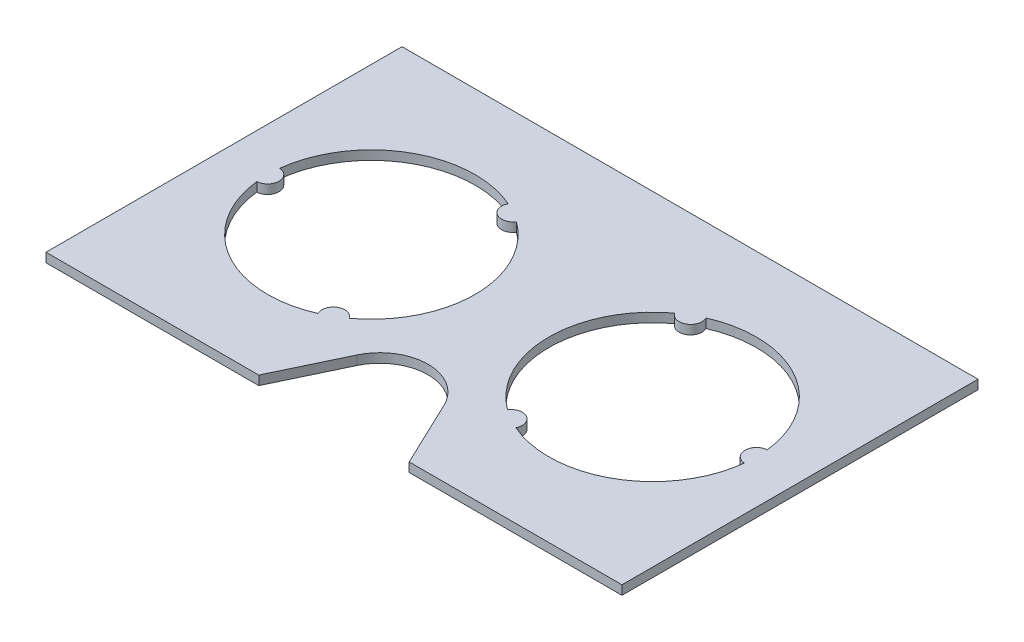
ISO-10303-21;
HEADER;
FILE_DESCRIPTION(('STEP AP214'),'2;1');
FILE_NAME('part.step','',(''),(''),'','','');
FILE_SCHEMA(('AUTOMOTIVE_DESIGN { 1 0 10303 214 1 1 1 1 }'));
ENDSEC;
DATA;
#1=APPLICATION_CONTEXT('core data for automotive mechanical design processes');
#2=APPLICATION_PROTOCOL_DEFINITION('international standard','automotive_design',2000,#1);
#3=PRODUCT_CONTEXT('',#1,'mechanical');
#4=PRODUCT('Part','Part','',(#3));
#5=PRODUCT_RELATED_PRODUCT_CATEGORY('part','',(#4));
#6=PRODUCT_DEFINITION_FORMATION('','',#4);
#7=PRODUCT_DEFINITION_CONTEXT('part definition',#1,'design');
#8=PRODUCT_DEFINITION('design','',#6,#7);
#9=PRODUCT_DEFINITION_SHAPE('','',#8);
#10=(LENGTH_UNIT() NAMED_UNIT(*) SI_UNIT(.MILLI.,.METRE.));
#11=(NAMED_UNIT(*) PLANE_ANGLE_UNIT() SI_UNIT($,.RADIAN.));
#12=(NAMED_UNIT(*) SI_UNIT($,.STERADIAN.) SOLID_ANGLE_UNIT());
#13=UNCERTAINTY_MEASURE_WITH_UNIT(LENGTH_MEASURE(1.E-05),#10,'distance_accuracy_value','');
#14=(GEOMETRIC_REPRESENTATION_CONTEXT(3) GLOBAL_UNCERTAINTY_ASSIGNED_CONTEXT((#13)) GLOBAL_UNIT_ASSIGNED_CONTEXT((#10,
#11,#12)) REPRESENTATION_CONTEXT('',''));
#15=CARTESIAN_POINT('',(0.,0.,0.));
#16=DIRECTION('',(0.,0.,1.));
#17=DIRECTION('',(1.,0.,0.));
#18=AXIS2_PLACEMENT_3D('',#15,#16,#17);
#19=CARTESIAN_POINT('',(62.85,2.,67.7020901521246));
#20=DIRECTION('',(0.,-1.,0.));
#21=DIRECTION('',(0.,0.,-1.));
#22=AXIS2_PLACEMENT_3D('',#19,#20,#21);
#23=PLANE('',#22);
#24=CARTESIAN_POINT('',(9.51,2.,38.85));
#25=DIRECTION('',(0.,-1.,0.));
#26=DIRECTION('',(0.,0.,-1.));
#27=AXIS2_PLACEMENT_3D('',#24,#25,#26);
#28=CIRCLE('',#27,2.5);
#29=CARTESIAN_POINT('',(9.64796909492274,2.,36.3538099974469));
#30=VERTEX_POINT('',#29);
#31=CARTESIAN_POINT('',(9.64796909492274,2.,41.3461900025532));
#32=VERTEX_POINT('',#31);
#33=EDGE_CURVE('E222',#30,#32,#28,.T.);
#34=ORIENTED_EDGE('',*,*,#33,.F.);
#35=CARTESIAN_POINT('',(32.16,2.,38.85));
#36=DIRECTION('',(0.,1.,0.));
#37=DIRECTION('',(0.,0.,-1.));
#38=AXIS2_PLACEMENT_3D('',#35,#36,#37);
#39=CIRCLE('',#38,22.65);
#40=CARTESIAN_POINT('',(41.2542514976548,2.,18.1059143441461));
#41=VERTEX_POINT('',#40);
#42=EDGE_CURVE('E234',#41,#30,#39,.T.);
#43=ORIENTED_EDGE('',*,*,#42,.F.);
#44=CARTESIAN_POINT('',(43.4849999999999,2.,19.2345246042824));
#45=DIRECTION('',(0.,-1.,0.));
#46=DIRECTION('',(0.,0.,1.));
#47=AXIS2_PLACEMENT_3D('',#44,#45,#46);
#48=CIRCLE('',#47,2.5);
#49=CARTESIAN_POINT('',(45.5777794074223,2.,20.6021043466992));
#50=VERTEX_POINT('',#49);
#51=EDGE_CURVE('E231',#50,#41,#48,.T.);
#52=ORIENTED_EDGE('',*,*,#51,.F.);
#53=CARTESIAN_POINT('',(32.16,2.,38.85));
#54=DIRECTION('',(0.,1.,0.));
#55=DIRECTION('',(0.,0.,-1.));
#56=AXIS2_PLACEMENT_3D('',#53,#54,#55);
#57=CIRCLE('',#56,22.65);
#58=CARTESIAN_POINT('',(45.5777794074223,2.,57.0978956533008));
#59=VERTEX_POINT('',#58);
#60=EDGE_CURVE('E229',#59,#50,#57,.T.);
#61=ORIENTED_EDGE('',*,*,#60,.F.);
#62=CARTESIAN_POINT('',(43.4849999999999,2.,58.4654753957176));
#63=DIRECTION('',(0.,-1.,0.));
#64=DIRECTION('',(0.,0.,1.));
#65=AXIS2_PLACEMENT_3D('',#62,#63,#64);
#66=CIRCLE('',#65,2.5);
#67=CARTESIAN_POINT('',(41.2542514976548,2.,59.5940856558539));
#68=VERTEX_POINT('',#67);
#69=EDGE_CURVE('E227',#68,#59,#66,.T.);
#70=ORIENTED_EDGE('',*,*,#69,.F.);
#71=CARTESIAN_POINT('',(32.16,2.,38.85));
#72=DIRECTION('',(0.,1.,0.));
#73=DIRECTION('',(0.,0.,-1.));
#74=AXIS2_PLACEMENT_3D('',#71,#72,#73);
#75=CIRCLE('',#74,22.65);
#76=EDGE_CURVE('E224',#32,#68,#75,.T.);
#77=ORIENTED_EDGE('',*,*,#76,.F.);
#78=EDGE_LOOP('',(#34,#43,#52,#61,#70,#77));
#79=FACE_BOUND('',#78,.T.);
#80=DIRECTION('',(0.,0.,1.));
#81=VECTOR('',#80,1.);
#82=CARTESIAN_POINT('',(0.,2.,0.));
#83=LINE('',#82,#81);
#84=CARTESIAN_POINT('',(0.,2.,0.));
#85=VERTEX_POINT('',#84);
#86=CARTESIAN_POINT('',(0.,2.,77.7));
#87=VERTEX_POINT('',#86);
#88=EDGE_CURVE('E267',#85,#87,#83,.T.);
#89=ORIENTED_EDGE('',*,*,#88,.T.);
#90=DIRECTION('',(1.,0.,0.));
#91=VECTOR('',#90,1.);
#92=CARTESIAN_POINT('',(0.,2.,77.7));
#93=LINE('',#92,#91);
#94=CARTESIAN_POINT('',(46.435,2.,77.7));
#95=VERTEX_POINT('',#94);
#96=EDGE_CURVE('E270',#87,#95,#93,.T.);
#97=ORIENTED_EDGE('',*,*,#96,.T.);
#98=DIRECTION('',(0.429929543633551,0.,-0.902862441078954));
#99=VECTOR('',#98,1.);
#100=CARTESIAN_POINT('',(46.435,2.,77.7));
#101=LINE('',#100,#99);
#102=CARTESIAN_POINT('',(53.35,2.,63.1783327349506));
#103=VERTEX_POINT('',#102);
#104=EDGE_CURVE('E273',#95,#103,#101,.T.);
#105=ORIENTED_EDGE('',*,*,#104,.T.);
#106=CARTESIAN_POINT('',(62.85,2.,67.7020901521246));
#107=DIRECTION('',(0.,-1.,0.));
#108=DIRECTION('',(0.,0.,-1.));
#109=AXIS2_PLACEMENT_3D('',#106,#107,#108);
#110=CIRCLE('',#109,10.5220901521246);
#111=CARTESIAN_POINT('',(72.35,2.,63.1783327349506));
#112=VERTEX_POINT('',#111);
#113=EDGE_CURVE('E275',#103,#112,#110,.T.);
#114=ORIENTED_EDGE('',*,*,#113,.T.);
#115=DIRECTION('',(0.42992954363355,0.,0.902862441078954));
#116=VECTOR('',#115,1.);
#117=CARTESIAN_POINT('',(72.35,2.,63.1783327349506));
#118=LINE('',#117,#116);
#119=CARTESIAN_POINT('',(79.265,2.,77.7));
#120=VERTEX_POINT('',#119);
#121=EDGE_CURVE('E277',#112,#120,#118,.T.);
#122=ORIENTED_EDGE('',*,*,#121,.T.);
#123=DIRECTION('',(1.,0.,0.));
#124=VECTOR('',#123,1.);
#125=CARTESIAN_POINT('',(79.265,2.,77.7));
#126=LINE('',#125,#124);
#127=CARTESIAN_POINT('',(125.7,2.,77.7));
#128=VERTEX_POINT('',#127);
#129=EDGE_CURVE('E279',#120,#128,#126,.T.);
#130=ORIENTED_EDGE('',*,*,#129,.T.);
#131=DIRECTION('',(0.,0.,-1.));
#132=VECTOR('',#131,1.);
#133=CARTESIAN_POINT('',(125.7,2.,0.));
#134=LINE('',#133,#132);
#135=CARTESIAN_POINT('',(125.7,2.,0.));
#136=VERTEX_POINT('',#135);
#137=EDGE_CURVE('E281',#128,#136,#134,.T.);
#138=ORIENTED_EDGE('',*,*,#137,.T.);
#139=DIRECTION('',(-1.,0.,0.));
#140=VECTOR('',#139,1.);
#141=CARTESIAN_POINT('',(0.,2.,0.));
#142=LINE('',#141,#140);
#143=EDGE_CURVE('E283',#136,#85,#142,.T.);
#144=ORIENTED_EDGE('',*,*,#143,.T.);
#145=EDGE_LOOP('',(#89,#97,#105,#114,#122,#130,#138,#144));
#146=FACE_BOUND('',#145,.T.);
#147=CARTESIAN_POINT('',(93.54,2.,38.85));
#148=DIRECTION('',(0.,1.,0.));
#149=DIRECTION('',(0.,0.,1.));
#150=AXIS2_PLACEMENT_3D('',#147,#148,#149);
#151=CIRCLE('',#150,22.65);
#152=CARTESIAN_POINT('',(80.1222205925777,2.,20.6021043466992));
#153=VERTEX_POINT('',#152);
#154=CARTESIAN_POINT('',(80.1222205925777,2.,57.0978956533008));
#155=VERTEX_POINT('',#154);
#156=EDGE_CURVE('E171',#153,#155,#151,.T.);
#157=ORIENTED_EDGE('',*,*,#156,.F.);
#158=CARTESIAN_POINT('',(82.2150000000001,2.,19.2345246042824));
#159=DIRECTION('',(0.,-1.,0.));
#160=DIRECTION('',(0.,0.,-1.));
#161=AXIS2_PLACEMENT_3D('',#158,#159,#160);
#162=CIRCLE('',#161,2.50000000000001);
#163=CARTESIAN_POINT('',(84.4457485023452,2.,18.1059143441461));
#164=VERTEX_POINT('',#163);
#165=EDGE_CURVE('E200',#164,#153,#162,.T.);
#166=ORIENTED_EDGE('',*,*,#165,.F.);
#167=CARTESIAN_POINT('',(93.54,2.,38.85));
#168=DIRECTION('',(0.,1.,0.));
#169=DIRECTION('',(0.,0.,1.));
#170=AXIS2_PLACEMENT_3D('',#167,#168,#169);
#171=CIRCLE('',#170,22.65);
#172=CARTESIAN_POINT('',(116.052030905077,2.,36.3538099974469));
#173=VERTEX_POINT('',#172);
#174=EDGE_CURVE('E198',#173,#164,#171,.T.);
#175=ORIENTED_EDGE('',*,*,#174,.F.);
#176=CARTESIAN_POINT('',(116.19,2.,38.85));
#177=DIRECTION('',(0.,-1.,0.));
#178=DIRECTION('',(0.,0.,1.));
#179=AXIS2_PLACEMENT_3D('',#176,#177,#178);
#180=CIRCLE('',#179,2.5);
#181=CARTESIAN_POINT('',(116.052030905077,2.,41.3461900025531));
#182=VERTEX_POINT('',#181);
#183=EDGE_CURVE('E194',#182,#173,#180,.T.);
#184=ORIENTED_EDGE('',*,*,#183,.F.);
#185=CARTESIAN_POINT('',(93.54,2.,38.85));
#186=DIRECTION('',(0.,1.,0.));
#187=DIRECTION('',(0.,0.,1.));
#188=AXIS2_PLACEMENT_3D('',#185,#186,#187);
#189=CIRCLE('',#188,22.65);
#190=CARTESIAN_POINT('',(84.4457485023452,2.,59.5940856558539));
#191=VERTEX_POINT('',#190);
#192=EDGE_CURVE('E192',#191,#182,#189,.T.);
#193=ORIENTED_EDGE('',*,*,#192,.F.);
#194=CARTESIAN_POINT('',(82.2150000000001,2.,58.4654753957176));
#195=DIRECTION('',(0.,-1.,0.));
#196=DIRECTION('',(0.,0.,-1.));
#197=AXIS2_PLACEMENT_3D('',#194,#195,#196);
#198=CIRCLE('',#197,2.5);
#199=EDGE_CURVE('E179',#155,#191,#198,.T.);
#200=ORIENTED_EDGE('',*,*,#199,.F.);
#201=EDGE_LOOP('',(#157,#166,#175,#184,#193,#200));
#202=FACE_BOUND('',#201,.T.);
#203=ADVANCED_FACE('F34',(#79,#146,#202),#23,.F.);
#204=CARTESIAN_POINT('',(62.85,0.,67.7020901521246));
#205=DIRECTION('',(0.,-1.,0.));
#206=DIRECTION('',(0.,0.,-1.));
#207=AXIS2_PLACEMENT_3D('',#204,#205,#206);
#208=PLANE('',#207);
#209=CARTESIAN_POINT('',(32.16,0.,38.85));
#210=DIRECTION('',(0.,1.,0.));
#211=DIRECTION('',(0.,0.,-1.));
#212=AXIS2_PLACEMENT_3D('',#209,#210,#211);
#213=CIRCLE('',#212,22.65);
#214=CARTESIAN_POINT('',(41.2542514976548,0.,18.1059143441461));
#215=VERTEX_POINT('',#214);
#216=CARTESIAN_POINT('',(9.64796909492274,0.,36.3538099974469));
#217=VERTEX_POINT('',#216);
#218=EDGE_CURVE('E225',#215,#217,#213,.T.);
#219=ORIENTED_EDGE('',*,*,#218,.T.);
#220=CARTESIAN_POINT('',(9.51,0.,38.85));
#221=DIRECTION('',(0.,-1.,0.));
#222=DIRECTION('',(0.,0.,-1.));
#223=AXIS2_PLACEMENT_3D('',#220,#221,#222);
#224=CIRCLE('',#223,2.5);
#225=CARTESIAN_POINT('',(9.64796909492274,0.,41.3461900025532));
#226=VERTEX_POINT('',#225);
#227=EDGE_CURVE('E187',#217,#226,#224,.T.);
#228=ORIENTED_EDGE('',*,*,#227,.T.);
#229=CARTESIAN_POINT('',(32.16,0.,38.85));
#230=DIRECTION('',(0.,1.,0.));
#231=DIRECTION('',(0.,0.,-1.));
#232=AXIS2_PLACEMENT_3D('',#229,#230,#231);
#233=CIRCLE('',#232,22.65);
#234=CARTESIAN_POINT('',(41.2542514976548,0.,59.5940856558539));
#235=VERTEX_POINT('',#234);
#236=EDGE_CURVE('E239',#226,#235,#233,.T.);
#237=ORIENTED_EDGE('',*,*,#236,.T.);
#238=CARTESIAN_POINT('',(43.4849999999999,0.,58.4654753957176));
#239=DIRECTION('',(0.,-1.,0.));
#240=DIRECTION('',(0.,0.,1.));
#241=AXIS2_PLACEMENT_3D('',#238,#239,#240);
#242=CIRCLE('',#241,2.5);
#243=CARTESIAN_POINT('',(45.5777794074223,0.,57.0978956533008));
#244=VERTEX_POINT('',#243);
#245=EDGE_CURVE('E242',#235,#244,#242,.T.);
#246=ORIENTED_EDGE('',*,*,#245,.T.);
#247=CARTESIAN_POINT('',(32.16,0.,38.85));
#248=DIRECTION('',(0.,1.,0.));
#249=DIRECTION('',(0.,0.,-1.));
#250=AXIS2_PLACEMENT_3D('',#247,#248,#249);
#251=CIRCLE('',#250,22.65);
#252=CARTESIAN_POINT('',(45.5777794074223,0.,20.6021043466992));
#253=VERTEX_POINT('',#252);
#254=EDGE_CURVE('E245',#244,#253,#251,.T.);
#255=ORIENTED_EDGE('',*,*,#254,.T.);
#256=CARTESIAN_POINT('',(43.4849999999999,0.,19.2345246042824));
#257=DIRECTION('',(0.,-1.,0.));
#258=DIRECTION('',(0.,0.,1.));
#259=AXIS2_PLACEMENT_3D('',#256,#257,#258);
#260=CIRCLE('',#259,2.5);
#261=EDGE_CURVE('E248',#253,#215,#260,.T.);
#262=ORIENTED_EDGE('',*,*,#261,.T.);
#263=EDGE_LOOP('',(#219,#228,#237,#246,#255,#262));
#264=FACE_BOUND('',#263,.T.);
#265=DIRECTION('',(0.,0.,1.));
#266=VECTOR('',#265,1.);
#267=CARTESIAN_POINT('',(0.,0.,0.));
#268=LINE('',#267,#266);
#269=CARTESIAN_POINT('',(0.,0.,0.));
#270=VERTEX_POINT('',#269);
#271=CARTESIAN_POINT('',(0.,0.,77.7));
#272=VERTEX_POINT('',#271);
#273=EDGE_CURVE('E266',#270,#272,#268,.T.);
#274=ORIENTED_EDGE('',*,*,#273,.F.);
#275=DIRECTION('',(-1.,0.,0.));
#276=VECTOR('',#275,1.);
#277=CARTESIAN_POINT('',(0.,0.,0.));
#278=LINE('',#277,#276);
#279=CARTESIAN_POINT('',(125.7,0.,0.));
#280=VERTEX_POINT('',#279);
#281=EDGE_CURVE('E271',#280,#270,#278,.T.);
#282=ORIENTED_EDGE('',*,*,#281,.F.);
#283=DIRECTION('',(0.,0.,-1.));
#284=VECTOR('',#283,1.);
#285=CARTESIAN_POINT('',(125.7,0.,0.));
#286=LINE('',#285,#284);
#287=CARTESIAN_POINT('',(125.7,0.,77.7));
#288=VERTEX_POINT('',#287);
#289=EDGE_CURVE('E298',#288,#280,#286,.T.);
#290=ORIENTED_EDGE('',*,*,#289,.F.);
#291=DIRECTION('',(1.,0.,0.));
#292=VECTOR('',#291,1.);
#293=CARTESIAN_POINT('',(79.265,0.,77.7));
#294=LINE('',#293,#292);
#295=CARTESIAN_POINT('',(79.265,0.,77.7));
#296=VERTEX_POINT('',#295);
#297=EDGE_CURVE('E296',#296,#288,#294,.T.);
#298=ORIENTED_EDGE('',*,*,#297,.F.);
#299=DIRECTION('',(0.42992954363355,0.,0.902862441078954));
#300=VECTOR('',#299,1.);
#301=CARTESIAN_POINT('',(72.35,0.,63.1783327349506));
#302=LINE('',#301,#300);
#303=CARTESIAN_POINT('',(72.35,0.,63.1783327349506));
#304=VERTEX_POINT('',#303);
#305=EDGE_CURVE('E294',#304,#296,#302,.T.);
#306=ORIENTED_EDGE('',*,*,#305,.F.);
#307=CARTESIAN_POINT('',(62.85,0.,67.7020901521246));
#308=DIRECTION('',(0.,-1.,0.));
#309=DIRECTION('',(0.,0.,-1.));
#310=AXIS2_PLACEMENT_3D('',#307,#308,#309);
#311=CIRCLE('',#310,10.5220901521246);
#312=CARTESIAN_POINT('',(53.35,0.,63.1783327349506));
#313=VERTEX_POINT('',#312);
#314=EDGE_CURVE('E292',#313,#304,#311,.T.);
#315=ORIENTED_EDGE('',*,*,#314,.F.);
#316=DIRECTION('',(0.429929543633551,0.,-0.902862441078954));
#317=VECTOR('',#316,1.);
#318=CARTESIAN_POINT('',(46.435,0.,77.7));
#319=LINE('',#318,#317);
#320=CARTESIAN_POINT('',(46.435,0.,77.7));
#321=VERTEX_POINT('',#320);
#322=EDGE_CURVE('E290',#321,#313,#319,.T.);
#323=ORIENTED_EDGE('',*,*,#322,.F.);
#324=DIRECTION('',(1.,0.,0.));
#325=VECTOR('',#324,1.);
#326=CARTESIAN_POINT('',(0.,0.,77.7));
#327=LINE('',#326,#325);
#328=EDGE_CURVE('E288',#272,#321,#327,.T.);
#329=ORIENTED_EDGE('',*,*,#328,.F.);
#330=EDGE_LOOP('',(#274,#282,#290,#298,#306,#315,#323,#329));
#331=FACE_BOUND('',#330,.T.);
#332=CARTESIAN_POINT('',(82.2150000000001,0.,19.2345246042824));
#333=DIRECTION('',(0.,-1.,0.));
#334=DIRECTION('',(0.,0.,-1.));
#335=AXIS2_PLACEMENT_3D('',#332,#333,#334);
#336=CIRCLE('',#335,2.50000000000001);
#337=CARTESIAN_POINT('',(84.4457485023452,0.,18.1059143441461));
#338=VERTEX_POINT('',#337);
#339=CARTESIAN_POINT('',(80.1222205925777,0.,20.6021043466992));
#340=VERTEX_POINT('',#339);
#341=EDGE_CURVE('E180',#338,#340,#336,.T.);
#342=ORIENTED_EDGE('',*,*,#341,.T.);
#343=CARTESIAN_POINT('',(93.54,0.,38.85));
#344=DIRECTION('',(0.,1.,0.));
#345=DIRECTION('',(0.,0.,1.));
#346=AXIS2_PLACEMENT_3D('',#343,#344,#345);
#347=CIRCLE('',#346,22.65);
#348=CARTESIAN_POINT('',(80.1222205925777,0.,57.0978956533008));
#349=VERTEX_POINT('',#348);
#350=EDGE_CURVE('E57',#340,#349,#347,.T.);
#351=ORIENTED_EDGE('',*,*,#350,.T.);
#352=CARTESIAN_POINT('',(82.2150000000001,0.,58.4654753957176));
#353=DIRECTION('',(0.,-1.,0.));
#354=DIRECTION('',(0.,0.,-1.));
#355=AXIS2_PLACEMENT_3D('',#352,#353,#354);
#356=CIRCLE('',#355,2.5);
#357=CARTESIAN_POINT('',(84.4457485023452,0.,59.5940856558539));
#358=VERTEX_POINT('',#357);
#359=EDGE_CURVE('E186',#349,#358,#356,.T.);
#360=ORIENTED_EDGE('',*,*,#359,.T.);
#361=CARTESIAN_POINT('',(93.54,0.,38.85));
#362=DIRECTION('',(0.,1.,0.));
#363=DIRECTION('',(0.,0.,1.));
#364=AXIS2_PLACEMENT_3D('',#361,#362,#363);
#365=CIRCLE('',#364,22.65);
#366=CARTESIAN_POINT('',(116.052030905077,0.,41.3461900025531));
#367=VERTEX_POINT('',#366);
#368=EDGE_CURVE('E204',#358,#367,#365,.T.);
#369=ORIENTED_EDGE('',*,*,#368,.T.);
#370=CARTESIAN_POINT('',(116.19,0.,38.85));
#371=DIRECTION('',(0.,-1.,0.));
#372=DIRECTION('',(0.,0.,1.));
#373=AXIS2_PLACEMENT_3D('',#370,#371,#372);
#374=CIRCLE('',#373,2.5);
#375=CARTESIAN_POINT('',(116.052030905077,0.,36.3538099974469));
#376=VERTEX_POINT('',#375);
#377=EDGE_CURVE('E207',#367,#376,#374,.T.);
#378=ORIENTED_EDGE('',*,*,#377,.T.);
#379=CARTESIAN_POINT('',(93.54,0.,38.85));
#380=DIRECTION('',(0.,1.,0.));
#381=DIRECTION('',(0.,0.,1.));
#382=AXIS2_PLACEMENT_3D('',#379,#380,#381);
#383=CIRCLE('',#382,22.65);
#384=EDGE_CURVE('E210',#376,#338,#383,.T.);
#385=ORIENTED_EDGE('',*,*,#384,.T.);
#386=EDGE_LOOP('',(#342,#351,#360,#369,#378,#385));
#387=FACE_BOUND('',#386,.T.);
#388=ADVANCED_FACE('F328',(#264,#331,#387),#208,.T.);
#389=CARTESIAN_POINT('',(0.,2.,0.));
#390=DIRECTION('',(1.,0.,0.));
#391=DIRECTION('',(0.,0.,-1.));
#392=AXIS2_PLACEMENT_3D('',#389,#390,#391);
#393=PLANE('',#392);
#394=ORIENTED_EDGE('',*,*,#273,.T.);
#395=DIRECTION('',(0.,-1.,0.));
#396=VECTOR('',#395,1.);
#397=CARTESIAN_POINT('',(0.,2.,77.7));
#398=LINE('',#397,#396);
#399=EDGE_CURVE('E11',#87,#272,#398,.T.);
#400=ORIENTED_EDGE('',*,*,#399,.F.);
#401=ORIENTED_EDGE('',*,*,#88,.F.);
#402=DIRECTION('',(0.,-1.,0.));
#403=VECTOR('',#402,1.);
#404=CARTESIAN_POINT('',(0.,2.,0.));
#405=LINE('',#404,#403);
#406=EDGE_CURVE('E285',#85,#270,#405,.T.);
#407=ORIENTED_EDGE('',*,*,#406,.T.);
#408=EDGE_LOOP('',(#394,#400,#401,#407));
#409=FACE_BOUND('',#408,.T.);
#410=ADVANCED_FACE('F36',(#409),#393,.F.);
#411=CARTESIAN_POINT('',(0.,2.,77.7));
#412=DIRECTION('',(0.,0.,-1.));
#413=DIRECTION('',(-1.,0.,0.));
#414=AXIS2_PLACEMENT_3D('',#411,#412,#413);
#415=PLANE('',#414);
#416=ORIENTED_EDGE('',*,*,#328,.T.);
#417=DIRECTION('',(0.,-1.,0.));
#418=VECTOR('',#417,1.);
#419=CARTESIAN_POINT('',(46.435,2.,77.7));
#420=LINE('',#419,#418);
#421=EDGE_CURVE('E42',#95,#321,#420,.T.);
#422=ORIENTED_EDGE('',*,*,#421,.F.);
#423=ORIENTED_EDGE('',*,*,#96,.F.);
#424=ORIENTED_EDGE('',*,*,#399,.T.);
#425=EDGE_LOOP('',(#416,#422,#423,#424));
#426=FACE_BOUND('',#425,.T.);
#427=ADVANCED_FACE('F345',(#426),#415,.F.);
#428=CARTESIAN_POINT('',(46.435,2.,77.7));
#429=DIRECTION('',(-0.902862441078954,0.,-0.429929543633551));
#430=DIRECTION('',(-0.429929543633551,0.,0.902862441078954));
#431=AXIS2_PLACEMENT_3D('',#428,#429,#430);
#432=PLANE('',#431);
#433=ORIENTED_EDGE('',*,*,#322,.T.);
#434=DIRECTION('',(0.,-1.,0.));
#435=VECTOR('',#434,1.);
#436=CARTESIAN_POINT('',(53.35,2.,63.1783327349506));
#437=LINE('',#436,#435);
#438=EDGE_CURVE('E315',#103,#313,#437,.T.);
#439=ORIENTED_EDGE('',*,*,#438,.F.);
#440=ORIENTED_EDGE('',*,*,#104,.F.);
#441=ORIENTED_EDGE('',*,*,#421,.T.);
#442=EDGE_LOOP('',(#433,#439,#440,#441));
#443=FACE_BOUND('',#442,.T.);
#444=ADVANCED_FACE('F322',(#443),#432,.F.);
#445=CARTESIAN_POINT('',(62.85,2.,67.7020901521246));
#446=DIRECTION('',(0.,-1.,0.));
#447=DIRECTION('',(0.,0.,-1.));
#448=AXIS2_PLACEMENT_3D('',#445,#446,#447);
#449=CYLINDRICAL_SURFACE('',#448,10.5220901521246);
#450=ORIENTED_EDGE('',*,*,#314,.T.);
#451=DIRECTION('',(0.,-1.,0.));
#452=VECTOR('',#451,1.);
#453=CARTESIAN_POINT('',(72.35,2.,63.1783327349506));
#454=LINE('',#453,#452);
#455=EDGE_CURVE('E312',#112,#304,#454,.T.);
#456=ORIENTED_EDGE('',*,*,#455,.F.);
#457=ORIENTED_EDGE('',*,*,#113,.F.);
#458=ORIENTED_EDGE('',*,*,#438,.T.);
#459=EDGE_LOOP('',(#450,#456,#457,#458));
#460=FACE_BOUND('',#459,.T.);
#461=ADVANCED_FACE('F334',(#460),#449,.F.);
#462=CARTESIAN_POINT('',(72.35,2.,63.1783327349506));
#463=DIRECTION('',(0.902862441078954,0.,-0.42992954363355));
#464=DIRECTION('',(-0.42992954363355,0.,-0.902862441078954));
#465=AXIS2_PLACEMENT_3D('',#462,#463,#464);
#466=PLANE('',#465);
#467=ORIENTED_EDGE('',*,*,#305,.T.);
#468=DIRECTION('',(0.,-1.,0.));
#469=VECTOR('',#468,1.);
#470=CARTESIAN_POINT('',(79.265,2.,77.7));
#471=LINE('',#470,#469);
#472=EDGE_CURVE('E309',#120,#296,#471,.T.);
#473=ORIENTED_EDGE('',*,*,#472,.F.);
#474=ORIENTED_EDGE('',*,*,#121,.F.);
#475=ORIENTED_EDGE('',*,*,#455,.T.);
#476=EDGE_LOOP('',(#467,#473,#474,#475));
#477=FACE_BOUND('',#476,.T.);
#478=ADVANCED_FACE('F338',(#477),#466,.F.);
#479=CARTESIAN_POINT('',(79.265,2.,77.7));
#480=DIRECTION('',(0.,0.,-1.));
#481=DIRECTION('',(-1.,0.,0.));
#482=AXIS2_PLACEMENT_3D('',#479,#480,#481);
#483=PLANE('',#482);
#484=ORIENTED_EDGE('',*,*,#297,.T.);
#485=DIRECTION('',(0.,-1.,0.));
#486=VECTOR('',#485,1.);
#487=CARTESIAN_POINT('',(125.7,2.,77.7));
#488=LINE('',#487,#486);
#489=EDGE_CURVE('E306',#128,#288,#488,.T.);
#490=ORIENTED_EDGE('',*,*,#489,.F.);
#491=ORIENTED_EDGE('',*,*,#129,.F.);
#492=ORIENTED_EDGE('',*,*,#472,.T.);
#493=EDGE_LOOP('',(#484,#490,#491,#492));
#494=FACE_BOUND('',#493,.T.);
#495=ADVANCED_FACE('F358',(#494),#483,.F.);
#496=CARTESIAN_POINT('',(125.7,2.,0.));
#497=DIRECTION('',(-1.,0.,0.));
#498=DIRECTION('',(0.,0.,1.));
#499=AXIS2_PLACEMENT_3D('',#496,#497,#498);
#500=PLANE('',#499);
#501=ORIENTED_EDGE('',*,*,#289,.T.);
#502=DIRECTION('',(0.,-1.,0.));
#503=VECTOR('',#502,1.);
#504=CARTESIAN_POINT('',(125.7,2.,0.));
#505=LINE('',#504,#503);
#506=EDGE_CURVE('E303',#136,#280,#505,.T.);
#507=ORIENTED_EDGE('',*,*,#506,.F.);
#508=ORIENTED_EDGE('',*,*,#137,.F.);
#509=ORIENTED_EDGE('',*,*,#489,.T.);
#510=EDGE_LOOP('',(#501,#507,#508,#509));
#511=FACE_BOUND('',#510,.T.);
#512=ADVANCED_FACE('F356',(#511),#500,.F.);
#513=CARTESIAN_POINT('',(0.,2.,0.));
#514=DIRECTION('',(0.,0.,1.));
#515=DIRECTION('',(1.,0.,0.));
#516=AXIS2_PLACEMENT_3D('',#513,#514,#515);
#517=PLANE('',#516);
#518=ORIENTED_EDGE('',*,*,#281,.T.);
#519=ORIENTED_EDGE('',*,*,#406,.F.);
#520=ORIENTED_EDGE('',*,*,#143,.F.);
#521=ORIENTED_EDGE('',*,*,#506,.T.);
#522=EDGE_LOOP('',(#518,#519,#520,#521));
#523=FACE_BOUND('',#522,.T.);
#524=ADVANCED_FACE('F351',(#523),#517,.F.);
#525=CARTESIAN_POINT('',(9.51,2.,38.85));
#526=DIRECTION('',(0.,-1.,0.));
#527=DIRECTION('',(0.,0.,-1.));
#528=AXIS2_PLACEMENT_3D('',#525,#526,#527);
#529=CYLINDRICAL_SURFACE('',#528,2.5);
#530=ORIENTED_EDGE('',*,*,#227,.F.);
#531=DIRECTION('',(0.,-1.,0.));
#532=VECTOR('',#531,1.);
#533=CARTESIAN_POINT('',(9.64796909492274,2.,36.3538099974469));
#534=LINE('',#533,#532);
#535=EDGE_CURVE('E236',#30,#217,#534,.T.);
#536=ORIENTED_EDGE('',*,*,#535,.F.);
#537=ORIENTED_EDGE('',*,*,#33,.T.);
#538=DIRECTION('',(0.,-1.,0.));
#539=VECTOR('',#538,1.);
#540=CARTESIAN_POINT('',(9.64796909492274,2.,41.3461900025532));
#541=LINE('',#540,#539);
#542=EDGE_CURVE('E263',#32,#226,#541,.T.);
#543=ORIENTED_EDGE('',*,*,#542,.T.);
#544=EDGE_LOOP('',(#530,#536,#537,#543));
#545=FACE_BOUND('',#544,.T.);
#546=ADVANCED_FACE('F377',(#545),#529,.T.);
#547=CARTESIAN_POINT('',(32.16,2.,38.85));
#548=DIRECTION('',(0.,-1.,0.));
#549=DIRECTION('',(0.,0.,-1.));
#550=AXIS2_PLACEMENT_3D('',#547,#548,#549);
#551=CYLINDRICAL_SURFACE('',#550,22.65);
#552=ORIENTED_EDGE('',*,*,#236,.F.);
#553=ORIENTED_EDGE('',*,*,#542,.F.);
#554=ORIENTED_EDGE('',*,*,#76,.T.);
#555=DIRECTION('',(0.,-1.,0.));
#556=VECTOR('',#555,1.);
#557=CARTESIAN_POINT('',(41.2542514976548,2.,59.5940856558539));
#558=LINE('',#557,#556);
#559=EDGE_CURVE('E261',#68,#235,#558,.T.);
#560=ORIENTED_EDGE('',*,*,#559,.T.);
#561=EDGE_LOOP('',(#552,#553,#554,#560));
#562=FACE_BOUND('',#561,.T.);
#563=ADVANCED_FACE('F384',(#562),#551,.F.);
#564=CARTESIAN_POINT('',(43.4849999999999,2.,58.4654753957176));
#565=DIRECTION('',(0.,-1.,0.));
#566=DIRECTION('',(0.,0.,-1.));
#567=AXIS2_PLACEMENT_3D('',#564,#565,#566);
#568=CYLINDRICAL_SURFACE('',#567,2.5);
#569=ORIENTED_EDGE('',*,*,#245,.F.);
#570=ORIENTED_EDGE('',*,*,#559,.F.);
#571=ORIENTED_EDGE('',*,*,#69,.T.);
#572=DIRECTION('',(0.,-1.,0.));
#573=VECTOR('',#572,1.);
#574=CARTESIAN_POINT('',(45.5777794074223,2.,57.0978956533008));
#575=LINE('',#574,#573);
#576=EDGE_CURVE('E259',#59,#244,#575,.T.);
#577=ORIENTED_EDGE('',*,*,#576,.T.);
#578=EDGE_LOOP('',(#569,#570,#571,#577));
#579=FACE_BOUND('',#578,.T.);
#580=ADVANCED_FACE('F389',(#579),#568,.T.);
#581=CARTESIAN_POINT('',(32.16,2.,38.85));
#582=DIRECTION('',(0.,-1.,0.));
#583=DIRECTION('',(0.,0.,-1.));
#584=AXIS2_PLACEMENT_3D('',#581,#582,#583);
#585=CYLINDRICAL_SURFACE('',#584,22.65);
#586=ORIENTED_EDGE('',*,*,#254,.F.);
#587=ORIENTED_EDGE('',*,*,#576,.F.);
#588=ORIENTED_EDGE('',*,*,#60,.T.);
#589=DIRECTION('',(0.,-1.,0.));
#590=VECTOR('',#589,1.);
#591=CARTESIAN_POINT('',(45.5777794074223,2.,20.6021043466992));
#592=LINE('',#591,#590);
#593=EDGE_CURVE('E257',#50,#253,#592,.T.);
#594=ORIENTED_EDGE('',*,*,#593,.T.);
#595=EDGE_LOOP('',(#586,#587,#588,#594));
#596=FACE_BOUND('',#595,.T.);
#597=ADVANCED_FACE('F411',(#596),#585,.F.);
#598=CARTESIAN_POINT('',(43.4849999999999,2.,19.2345246042824));
#599=DIRECTION('',(0.,-1.,0.));
#600=DIRECTION('',(0.,0.,-1.));
#601=AXIS2_PLACEMENT_3D('',#598,#599,#600);
#602=CYLINDRICAL_SURFACE('',#601,2.5);
#603=ORIENTED_EDGE('',*,*,#261,.F.);
#604=ORIENTED_EDGE('',*,*,#593,.F.);
#605=ORIENTED_EDGE('',*,*,#51,.T.);
#606=DIRECTION('',(0.,-1.,0.));
#607=VECTOR('',#606,1.);
#608=CARTESIAN_POINT('',(41.2542514976548,2.,18.1059143441461));
#609=LINE('',#608,#607);
#610=EDGE_CURVE('E255',#41,#215,#609,.T.);
#611=ORIENTED_EDGE('',*,*,#610,.T.);
#612=EDGE_LOOP('',(#603,#604,#605,#611));
#613=FACE_BOUND('',#612,.T.);
#614=ADVANCED_FACE('F401',(#613),#602,.T.);
#615=CARTESIAN_POINT('',(32.16,2.,38.85));
#616=DIRECTION('',(0.,-1.,0.));
#617=DIRECTION('',(0.,0.,-1.));
#618=AXIS2_PLACEMENT_3D('',#615,#616,#617);
#619=CYLINDRICAL_SURFACE('',#618,22.65);
#620=ORIENTED_EDGE('',*,*,#218,.F.);
#621=ORIENTED_EDGE('',*,*,#610,.F.);
#622=ORIENTED_EDGE('',*,*,#42,.T.);
#623=ORIENTED_EDGE('',*,*,#535,.T.);
#624=EDGE_LOOP('',(#620,#621,#622,#623));
#625=FACE_BOUND('',#624,.T.);
#626=ADVANCED_FACE('F395',(#625),#619,.F.);
#627=CARTESIAN_POINT('',(93.54,2.,38.85));
#628=DIRECTION('',(0.,-1.,0.));
#629=DIRECTION('',(0.,0.,-1.));
#630=AXIS2_PLACEMENT_3D('',#627,#628,#629);
#631=CYLINDRICAL_SURFACE('',#630,22.65);
#632=ORIENTED_EDGE('',*,*,#350,.F.);
#633=DIRECTION('',(0.,-1.,0.));
#634=VECTOR('',#633,1.);
#635=CARTESIAN_POINT('',(80.1222205925777,2.,20.6021043466992));
#636=LINE('',#635,#634);
#637=EDGE_CURVE('E175',#153,#340,#636,.T.);
#638=ORIENTED_EDGE('',*,*,#637,.F.);
#639=ORIENTED_EDGE('',*,*,#156,.T.);
#640=DIRECTION('',(0.,-1.,0.));
#641=VECTOR('',#640,1.);
#642=CARTESIAN_POINT('',(80.1222205925777,2.,57.0978956533008));
#643=LINE('',#642,#641);
#644=EDGE_CURVE('E174',#155,#349,#643,.T.);
#645=ORIENTED_EDGE('',*,*,#644,.T.);
#646=EDGE_LOOP('',(#632,#638,#639,#645));
#647=FACE_BOUND('',#646,.T.);
#648=ADVANCED_FACE('F173',(#647),#631,.F.);
#649=CARTESIAN_POINT('',(82.2150000000001,2.,58.4654753957176));
#650=DIRECTION('',(0.,-1.,0.));
#651=DIRECTION('',(0.,0.,-1.));
#652=AXIS2_PLACEMENT_3D('',#649,#650,#651);
#653=CYLINDRICAL_SURFACE('',#652,2.5);
#654=ORIENTED_EDGE('',*,*,#359,.F.);
#655=ORIENTED_EDGE('',*,*,#644,.F.);
#656=ORIENTED_EDGE('',*,*,#199,.T.);
#657=DIRECTION('',(0.,-1.,0.));
#658=VECTOR('',#657,1.);
#659=CARTESIAN_POINT('',(84.4457485023452,2.,59.5940856558539));
#660=LINE('',#659,#658);
#661=EDGE_CURVE('E188',#191,#358,#660,.T.);
#662=ORIENTED_EDGE('',*,*,#661,.T.);
#663=EDGE_LOOP('',(#654,#655,#656,#662));
#664=FACE_BOUND('',#663,.T.);
#665=ADVANCED_FACE('F183',(#664),#653,.T.);
#666=CARTESIAN_POINT('',(93.54,2.,38.85));
#667=DIRECTION('',(0.,-1.,0.));
#668=DIRECTION('',(0.,0.,-1.));
#669=AXIS2_PLACEMENT_3D('',#666,#667,#668);
#670=CYLINDRICAL_SURFACE('',#669,22.65);
#671=ORIENTED_EDGE('',*,*,#368,.F.);
#672=ORIENTED_EDGE('',*,*,#661,.F.);
#673=ORIENTED_EDGE('',*,*,#192,.T.);
#674=DIRECTION('',(0.,-1.,0.));
#675=VECTOR('',#674,1.);
#676=CARTESIAN_POINT('',(116.052030905077,2.,41.3461900025531));
#677=LINE('',#676,#675);
#678=EDGE_CURVE('E219',#182,#367,#677,.T.);
#679=ORIENTED_EDGE('',*,*,#678,.T.);
#680=EDGE_LOOP('',(#671,#672,#673,#679));
#681=FACE_BOUND('',#680,.T.);
#682=ADVANCED_FACE('F427',(#681),#670,.F.);
#683=CARTESIAN_POINT('',(116.19,2.,38.85));
#684=DIRECTION('',(0.,-1.,0.));
#685=DIRECTION('',(0.,0.,-1.));
#686=AXIS2_PLACEMENT_3D('',#683,#684,#685);
#687=CYLINDRICAL_SURFACE('',#686,2.5);
#688=ORIENTED_EDGE('',*,*,#377,.F.);
#689=ORIENTED_EDGE('',*,*,#678,.F.);
#690=ORIENTED_EDGE('',*,*,#183,.T.);
#691=DIRECTION('',(0.,-1.,0.));
#692=VECTOR('',#691,1.);
#693=CARTESIAN_POINT('',(116.052030905077,2.,36.3538099974469));
#694=LINE('',#693,#692);
#695=EDGE_CURVE('E217',#173,#376,#694,.T.);
#696=ORIENTED_EDGE('',*,*,#695,.T.);
#697=EDGE_LOOP('',(#688,#689,#690,#696));
#698=FACE_BOUND('',#697,.T.);
#699=ADVANCED_FACE('F430',(#698),#687,.T.);
#700=CARTESIAN_POINT('',(93.54,2.,38.85));
#701=DIRECTION('',(0.,-1.,0.));
#702=DIRECTION('',(0.,0.,-1.));
#703=AXIS2_PLACEMENT_3D('',#700,#701,#702);
#704=CYLINDRICAL_SURFACE('',#703,22.65);
#705=ORIENTED_EDGE('',*,*,#384,.F.);
#706=ORIENTED_EDGE('',*,*,#695,.F.);
#707=ORIENTED_EDGE('',*,*,#174,.T.);
#708=DIRECTION('',(0.,-1.,0.));
#709=VECTOR('',#708,1.);
#710=CARTESIAN_POINT('',(84.4457485023452,2.,18.1059143441461));
#711=LINE('',#710,#709);
#712=EDGE_CURVE('E49',#164,#338,#711,.T.);
#713=ORIENTED_EDGE('',*,*,#712,.T.);
#714=EDGE_LOOP('',(#705,#706,#707,#713));
#715=FACE_BOUND('',#714,.T.);
#716=ADVANCED_FACE('F434',(#715),#704,.F.);
#717=CARTESIAN_POINT('',(82.2150000000001,2.,19.2345246042824));
#718=DIRECTION('',(0.,-1.,0.));
#719=DIRECTION('',(0.,0.,-1.));
#720=AXIS2_PLACEMENT_3D('',#717,#718,#719);
#721=CYLINDRICAL_SURFACE('',#720,2.50000000000001);
#722=ORIENTED_EDGE('',*,*,#341,.F.);
#723=ORIENTED_EDGE('',*,*,#712,.F.);
#724=ORIENTED_EDGE('',*,*,#165,.T.);
#725=ORIENTED_EDGE('',*,*,#637,.T.);
#726=EDGE_LOOP('',(#722,#723,#724,#725));
#727=FACE_BOUND('',#726,.T.);
#728=ADVANCED_FACE('F438',(#727),#721,.T.);
#729=CLOSED_SHELL('',(#203,#388,#410,#427,#444,#461,#478,#495,#512,#524,#546,#563,#580,#597,
#614,#626,#648,#665,#682,#699,#716,#728));
#730=MANIFOLD_SOLID_BREP('B2',#729);
#731=ADVANCED_BREP_SHAPE_REPRESENTATION('',(#18,#730),#14);
#732=SHAPE_DEFINITION_REPRESENTATION(#9,#731);
ENDSEC;
END-ISO-10303-21;
